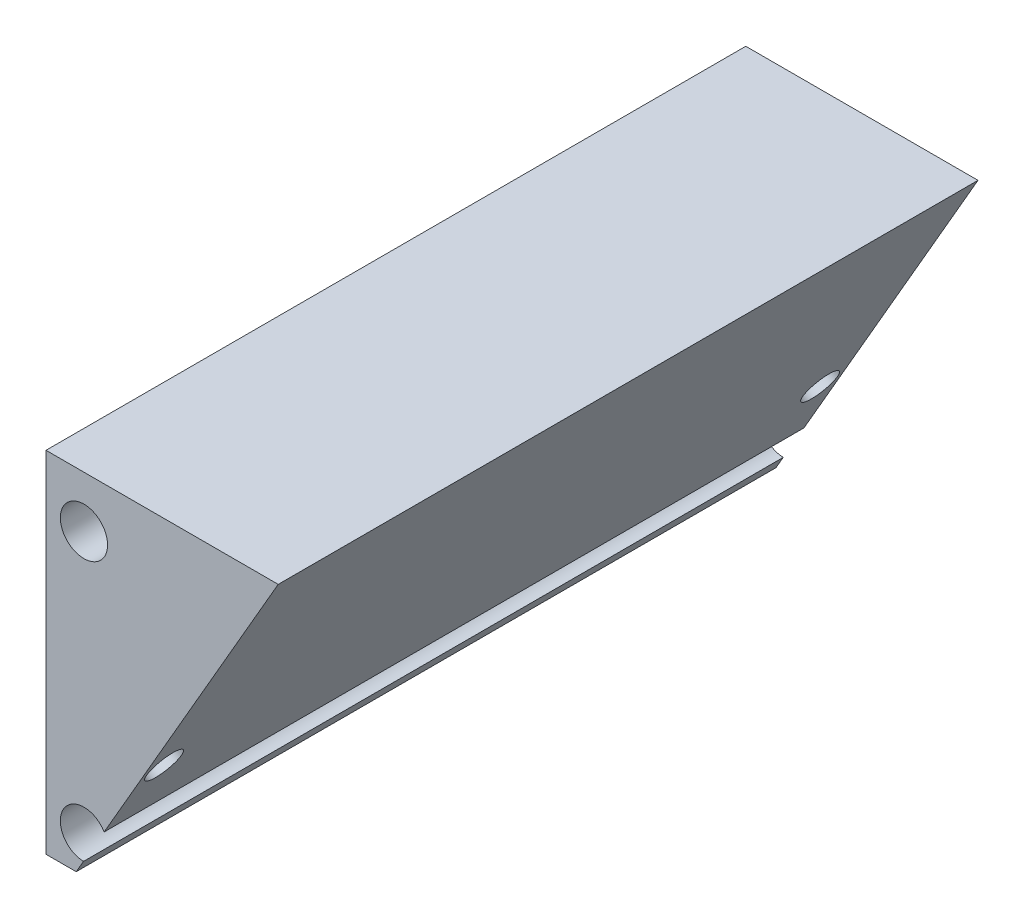
ISO-10303-21;
HEADER;
FILE_DESCRIPTION(('STEP AP214'),'2;1');
FILE_NAME('part.step','',(''),(''),'','','');
FILE_SCHEMA(('AUTOMOTIVE_DESIGN { 1 0 10303 214 1 1 1 1 }'));
ENDSEC;
DATA;
#1=APPLICATION_CONTEXT('core data for automotive mechanical design processes');
#2=APPLICATION_PROTOCOL_DEFINITION('international standard','automotive_design',2000,#1);
#3=PRODUCT_CONTEXT('',#1,'mechanical');
#4=PRODUCT('Part','Part','',(#3));
#5=PRODUCT_RELATED_PRODUCT_CATEGORY('part','',(#4));
#6=PRODUCT_DEFINITION_FORMATION('','',#4);
#7=PRODUCT_DEFINITION_CONTEXT('part definition',#1,'design');
#8=PRODUCT_DEFINITION('design','',#6,#7);
#9=PRODUCT_DEFINITION_SHAPE('','',#8);
#10=(LENGTH_UNIT() NAMED_UNIT(*) SI_UNIT(.MILLI.,.METRE.));
#11=(NAMED_UNIT(*) PLANE_ANGLE_UNIT() SI_UNIT($,.RADIAN.));
#12=(NAMED_UNIT(*) SI_UNIT($,.STERADIAN.) SOLID_ANGLE_UNIT());
#13=UNCERTAINTY_MEASURE_WITH_UNIT(LENGTH_MEASURE(1.E-05),#10,'distance_accuracy_value','');
#14=(GEOMETRIC_REPRESENTATION_CONTEXT(3) GLOBAL_UNCERTAINTY_ASSIGNED_CONTEXT((#13)) GLOBAL_UNIT_ASSIGNED_CONTEXT((#10,
#11,#12)) REPRESENTATION_CONTEXT('',''));
#15=CARTESIAN_POINT('',(0.,0.,0.));
#16=DIRECTION('',(0.,0.,1.));
#17=DIRECTION('',(1.,0.,0.));
#18=AXIS2_PLACEMENT_3D('',#15,#16,#17);
#19=CARTESIAN_POINT('',(-5.33042439962429,-7.92921842259811,40.));
#20=DIRECTION('',(0.,0.,1.));
#21=DIRECTION('',(1.,0.,0.));
#22=AXIS2_PLACEMENT_3D('',#19,#20,#21);
#23=PLANE('',#22);
#24=CARTESIAN_POINT('',(-5.33042439962429,-7.92921842259811,40.));
#25=DIRECTION('',(0.,0.,-1.));
#26=DIRECTION('',(1.,0.,0.));
#27=AXIS2_PLACEMENT_3D('',#24,#25,#26);
#28=CIRCLE('',#27,1.35);
#29=CARTESIAN_POINT('',(-5.35720586766859,-9.27895274940817,40.));
#30=VERTEX_POINT('',#29);
#31=CARTESIAN_POINT('',(-4.17491091826905,-7.23115782751607,40.));
#32=VERTEX_POINT('',#31);
#33=EDGE_CURVE('E130',#30,#32,#28,.T.);
#34=ORIENTED_EDGE('',*,*,#33,.T.);
#35=DIRECTION('',(0.499999999999998,0.86602540378444,0.));
#36=VECTOR('',#35,1.);
#37=CARTESIAN_POINT('',(0.,0.,40.));
#38=LINE('',#37,#36);
#39=CARTESIAN_POINT('',(5.77350269189622,10.,40.));
#40=VERTEX_POINT('',#39);
#41=EDGE_CURVE('E88',#32,#40,#38,.T.);
#42=ORIENTED_EDGE('',*,*,#41,.T.);
#43=DIRECTION('',(-1.,0.,0.));
#44=VECTOR('',#43,1.);
#45=CARTESIAN_POINT('',(-7.5,10.,40.));
#46=LINE('',#45,#44);
#47=CARTESIAN_POINT('',(-7.5,10.,40.));
#48=VERTEX_POINT('',#47);
#49=EDGE_CURVE('E101',#40,#48,#46,.T.);
#50=ORIENTED_EDGE('',*,*,#49,.T.);
#51=DIRECTION('',(0.,-1.,0.));
#52=VECTOR('',#51,1.);
#53=CARTESIAN_POINT('',(-7.5,10.,40.));
#54=LINE('',#53,#52);
#55=CARTESIAN_POINT('',(-7.5,-10.,40.));
#56=VERTEX_POINT('',#55);
#57=EDGE_CURVE('E95',#48,#56,#54,.T.);
#58=ORIENTED_EDGE('',*,*,#57,.T.);
#59=DIRECTION('',(1.,0.,0.));
#60=VECTOR('',#59,1.);
#61=CARTESIAN_POINT('',(-7.5,-10.,40.));
#62=LINE('',#61,#60);
#63=CARTESIAN_POINT('',(-5.77350269189622,-10.,40.));
#64=VERTEX_POINT('',#63);
#65=EDGE_CURVE('E99',#56,#64,#62,.T.);
#66=ORIENTED_EDGE('',*,*,#65,.T.);
#67=DIRECTION('',(0.499999999999999,0.866025403784439,0.));
#68=VECTOR('',#67,1.);
#69=CARTESIAN_POINT('',(-5.35720586766859,-9.27895274940817,40.));
#70=LINE('',#69,#68);
#71=EDGE_CURVE('E51',#64,#30,#70,.T.);
#72=ORIENTED_EDGE('',*,*,#71,.T.);
#73=EDGE_LOOP('',(#34,#42,#50,#58,#66,#72));
#74=FACE_BOUND('',#73,.T.);
#75=CARTESIAN_POINT('',(-5.33042439962429,7.07078157740189,40.));
#76=DIRECTION('',(0.,0.,1.));
#77=DIRECTION('',(1.,0.,0.));
#78=AXIS2_PLACEMENT_3D('',#75,#76,#77);
#79=CIRCLE('',#78,1.35);
#80=CARTESIAN_POINT('',(-3.98042439962429,7.07078157740189,40.));
#81=VERTEX_POINT('',#80);
#82=EDGE_CURVE('E123',#81,#81,#79,.T.);
#83=ORIENTED_EDGE('',*,*,#82,.F.);
#84=EDGE_LOOP('',(#83));
#85=FACE_BOUND('',#84,.T.);
#86=ADVANCED_FACE('F32',(#74,#85),#23,.T.);
#87=CARTESIAN_POINT('',(-5.33042439962429,-7.92921842259811,0.));
#88=DIRECTION('',(0.,0.,1.));
#89=DIRECTION('',(1.,0.,0.));
#90=AXIS2_PLACEMENT_3D('',#87,#88,#89);
#91=PLANE('',#90);
#92=CARTESIAN_POINT('',(-5.33042439962429,-7.92921842259811,0.));
#93=DIRECTION('',(0.,0.,-1.));
#94=DIRECTION('',(1.,0.,0.));
#95=AXIS2_PLACEMENT_3D('',#92,#93,#94);
#96=CIRCLE('',#95,1.35);
#97=CARTESIAN_POINT('',(-5.35720586766859,-9.27895274940817,0.));
#98=VERTEX_POINT('',#97);
#99=CARTESIAN_POINT('',(-4.17491091826905,-7.23115782751607,0.));
#100=VERTEX_POINT('',#99);
#101=EDGE_CURVE('E119',#98,#100,#96,.T.);
#102=ORIENTED_EDGE('',*,*,#101,.F.);
#103=DIRECTION('',(0.499999999999999,0.866025403784439,0.));
#104=VECTOR('',#103,1.);
#105=CARTESIAN_POINT('',(-5.35720586766859,-9.27895274940817,0.));
#106=LINE('',#105,#104);
#107=CARTESIAN_POINT('',(-5.77350269189622,-10.,0.));
#108=VERTEX_POINT('',#107);
#109=EDGE_CURVE('E80',#108,#98,#106,.T.);
#110=ORIENTED_EDGE('',*,*,#109,.F.);
#111=DIRECTION('',(1.,0.,0.));
#112=VECTOR('',#111,1.);
#113=CARTESIAN_POINT('',(-7.5,-10.,0.));
#114=LINE('',#113,#112);
#115=CARTESIAN_POINT('',(-7.5,-10.,0.));
#116=VERTEX_POINT('',#115);
#117=EDGE_CURVE('E74',#116,#108,#114,.T.);
#118=ORIENTED_EDGE('',*,*,#117,.F.);
#119=DIRECTION('',(0.,-1.,0.));
#120=VECTOR('',#119,1.);
#121=CARTESIAN_POINT('',(-7.5,10.,0.));
#122=LINE('',#121,#120);
#123=CARTESIAN_POINT('',(-7.5,10.,0.));
#124=VERTEX_POINT('',#123);
#125=EDGE_CURVE('E109',#124,#116,#122,.T.);
#126=ORIENTED_EDGE('',*,*,#125,.F.);
#127=DIRECTION('',(-1.,0.,0.));
#128=VECTOR('',#127,1.);
#129=CARTESIAN_POINT('',(-7.5,10.,0.));
#130=LINE('',#129,#128);
#131=CARTESIAN_POINT('',(5.77350269189622,10.,0.));
#132=VERTEX_POINT('',#131);
#133=EDGE_CURVE('E125',#132,#124,#130,.T.);
#134=ORIENTED_EDGE('',*,*,#133,.F.);
#135=DIRECTION('',(0.499999999999998,0.86602540378444,0.));
#136=VECTOR('',#135,1.);
#137=CARTESIAN_POINT('',(0.,0.,0.));
#138=LINE('',#137,#136);
#139=EDGE_CURVE('E122',#100,#132,#138,.T.);
#140=ORIENTED_EDGE('',*,*,#139,.F.);
#141=EDGE_LOOP('',(#102,#110,#118,#126,#134,#140));
#142=FACE_BOUND('',#141,.T.);
#143=CARTESIAN_POINT('',(-5.33042439962429,7.07078157740189,0.));
#144=DIRECTION('',(0.,0.,1.));
#145=DIRECTION('',(1.,0.,0.));
#146=AXIS2_PLACEMENT_3D('',#143,#144,#145);
#147=CIRCLE('',#146,1.35);
#148=CARTESIAN_POINT('',(-3.98042439962429,7.07078157740189,0.));
#149=VERTEX_POINT('',#148);
#150=EDGE_CURVE('E137',#149,#149,#147,.T.);
#151=ORIENTED_EDGE('',*,*,#150,.T.);
#152=EDGE_LOOP('',(#151));
#153=FACE_BOUND('',#152,.T.);
#154=ADVANCED_FACE('F162',(#142,#153),#91,.F.);
#155=CARTESIAN_POINT('',(-5.33042439962429,-7.92921842259811,40.));
#156=DIRECTION('',(0.,0.,-1.));
#157=DIRECTION('',(-1.,0.,0.));
#158=AXIS2_PLACEMENT_3D('',#155,#156,#157);
#159=CYLINDRICAL_SURFACE('',#158,1.35);
#160=ORIENTED_EDGE('',*,*,#101,.T.);
#161=DIRECTION('',(0.,0.,-1.));
#162=VECTOR('',#161,1.);
#163=CARTESIAN_POINT('',(-4.17491091826905,-7.23115782751607,40.));
#164=LINE('',#163,#162);
#165=EDGE_CURVE('E11',#32,#100,#164,.T.);
#166=ORIENTED_EDGE('',*,*,#165,.F.);
#167=ORIENTED_EDGE('',*,*,#33,.F.);
#168=DIRECTION('',(0.,0.,-1.));
#169=VECTOR('',#168,1.);
#170=CARTESIAN_POINT('',(-5.35720586766859,-9.27895274940817,40.));
#171=LINE('',#170,#169);
#172=EDGE_CURVE('E115',#30,#98,#171,.T.);
#173=ORIENTED_EDGE('',*,*,#172,.T.);
#174=EDGE_LOOP('',(#160,#166,#167,#173));
#175=FACE_BOUND('',#174,.T.);
#176=ADVANCED_FACE('F34',(#175),#159,.F.);
#177=CARTESIAN_POINT('',(0.,0.,40.));
#178=DIRECTION('',(-0.86602540378444,0.499999999999998,0.));
#179=DIRECTION('',(-0.499999999999998,-0.86602540378444,0.));
#180=AXIS2_PLACEMENT_3D('',#177,#178,#179);
#181=PLANE('',#180);
#182=CARTESIAN_POINT('',(-1.99999999999999,-3.46410161513776,38.75));
#183=DIRECTION('',(0.86602540378444,-0.499999999999998,0.));
#184=DIRECTION('',(0.499999999999998,0.86602540378444,0.));
#185=AXIS2_PLACEMENT_3D('',#182,#183,#184);
#186=CIRCLE('',#185,0.999999999999998);
#187=CARTESIAN_POINT('',(-1.49999999999999,-2.59807621135332,38.75));
#188=VERTEX_POINT('',#187);
#189=EDGE_CURVE('E148',#188,#188,#186,.T.);
#190=ORIENTED_EDGE('',*,*,#189,.F.);
#191=EDGE_LOOP('',(#190));
#192=FACE_BOUND('',#191,.T.);
#193=CARTESIAN_POINT('',(-1.99999999999999,-3.46410161513776,1.25));
#194=DIRECTION('',(0.86602540378444,-0.499999999999998,0.));
#195=DIRECTION('',(0.499999999999998,0.86602540378444,0.));
#196=AXIS2_PLACEMENT_3D('',#193,#194,#195);
#197=CIRCLE('',#196,1.);
#198=CARTESIAN_POINT('',(-1.49999999999999,-2.59807621135332,1.25));
#199=VERTEX_POINT('',#198);
#200=EDGE_CURVE('E138',#199,#199,#197,.T.);
#201=ORIENTED_EDGE('',*,*,#200,.F.);
#202=EDGE_LOOP('',(#201));
#203=FACE_BOUND('',#202,.T.);
#204=ORIENTED_EDGE('',*,*,#139,.T.);
#205=DIRECTION('',(0.,0.,-1.));
#206=VECTOR('',#205,1.);
#207=CARTESIAN_POINT('',(5.77350269189622,10.,40.));
#208=LINE('',#207,#206);
#209=EDGE_CURVE('E42',#40,#132,#208,.T.);
#210=ORIENTED_EDGE('',*,*,#209,.F.);
#211=ORIENTED_EDGE('',*,*,#41,.F.);
#212=ORIENTED_EDGE('',*,*,#165,.T.);
#213=EDGE_LOOP('',(#204,#210,#211,#212));
#214=FACE_BOUND('',#213,.T.);
#215=ADVANCED_FACE('F156',(#192,#203,#214),#181,.F.);
#216=CARTESIAN_POINT('',(-7.5,10.,40.));
#217=DIRECTION('',(0.,-1.,0.));
#218=DIRECTION('',(0.,0.,-1.));
#219=AXIS2_PLACEMENT_3D('',#216,#217,#218);
#220=PLANE('',#219);
#221=ORIENTED_EDGE('',*,*,#133,.T.);
#222=DIRECTION('',(0.,0.,-1.));
#223=VECTOR('',#222,1.);
#224=CARTESIAN_POINT('',(-7.5,10.,40.));
#225=LINE('',#224,#223);
#226=EDGE_CURVE('E110',#48,#124,#225,.T.);
#227=ORIENTED_EDGE('',*,*,#226,.F.);
#228=ORIENTED_EDGE('',*,*,#49,.F.);
#229=ORIENTED_EDGE('',*,*,#209,.T.);
#230=EDGE_LOOP('',(#221,#227,#228,#229));
#231=FACE_BOUND('',#230,.T.);
#232=ADVANCED_FACE('F159',(#231),#220,.F.);
#233=CARTESIAN_POINT('',(-7.5,10.,40.));
#234=DIRECTION('',(1.,0.,0.));
#235=DIRECTION('',(0.,1.,0.));
#236=AXIS2_PLACEMENT_3D('',#233,#234,#235);
#237=PLANE('',#236);
#238=CARTESIAN_POINT('',(-7.5,-0.288675134594834,38.75));
#239=DIRECTION('',(1.,0.,0.));
#240=DIRECTION('',(0.,-1.,0.));
#241=AXIS2_PLACEMENT_3D('',#238,#239,#240);
#242=ELLIPSE('',#241,1.15470053837925,0.999999999999998);
#243=CARTESIAN_POINT('',(-7.5,-1.44337567297408,38.75));
#244=VERTEX_POINT('',#243);
#245=EDGE_CURVE('E36',#244,#244,#242,.T.);
#246=ORIENTED_EDGE('',*,*,#245,.T.);
#247=EDGE_LOOP('',(#246));
#248=FACE_BOUND('',#247,.T.);
#249=CARTESIAN_POINT('',(-7.5,-0.288675134594834,1.25));
#250=DIRECTION('',(1.,0.,0.));
#251=DIRECTION('',(0.,-1.,0.));
#252=AXIS2_PLACEMENT_3D('',#249,#250,#251);
#253=ELLIPSE('',#252,1.15470053837925,1.);
#254=CARTESIAN_POINT('',(-7.5,-1.44337567297408,1.25));
#255=VERTEX_POINT('',#254);
#256=EDGE_CURVE('E135',#255,#255,#253,.T.);
#257=ORIENTED_EDGE('',*,*,#256,.T.);
#258=EDGE_LOOP('',(#257));
#259=FACE_BOUND('',#258,.T.);
#260=ORIENTED_EDGE('',*,*,#125,.T.);
#261=DIRECTION('',(0.,0.,-1.));
#262=VECTOR('',#261,1.);
#263=CARTESIAN_POINT('',(-7.5,-10.,40.));
#264=LINE('',#263,#262);
#265=EDGE_CURVE('E106',#56,#116,#264,.T.);
#266=ORIENTED_EDGE('',*,*,#265,.F.);
#267=ORIENTED_EDGE('',*,*,#57,.F.);
#268=ORIENTED_EDGE('',*,*,#226,.T.);
#269=EDGE_LOOP('',(#260,#266,#267,#268));
#270=FACE_BOUND('',#269,.T.);
#271=ADVANCED_FACE('F107',(#248,#259,#270),#237,.F.);
#272=CARTESIAN_POINT('',(-7.5,-10.,40.));
#273=DIRECTION('',(0.,1.,0.));
#274=DIRECTION('',(0.,0.,1.));
#275=AXIS2_PLACEMENT_3D('',#272,#273,#274);
#276=PLANE('',#275);
#277=ORIENTED_EDGE('',*,*,#117,.T.);
#278=DIRECTION('',(0.,0.,-1.));
#279=VECTOR('',#278,1.);
#280=CARTESIAN_POINT('',(-5.77350269189622,-10.,40.));
#281=LINE('',#280,#279);
#282=EDGE_CURVE('E111',#64,#108,#281,.T.);
#283=ORIENTED_EDGE('',*,*,#282,.F.);
#284=ORIENTED_EDGE('',*,*,#65,.F.);
#285=ORIENTED_EDGE('',*,*,#265,.T.);
#286=EDGE_LOOP('',(#277,#283,#284,#285));
#287=FACE_BOUND('',#286,.T.);
#288=ADVANCED_FACE('F113',(#287),#276,.F.);
#289=CARTESIAN_POINT('',(-5.35720586766859,-9.27895274940817,40.));
#290=DIRECTION('',(-0.866025403784439,0.499999999999999,0.));
#291=DIRECTION('',(-0.499999999999999,-0.866025403784439,0.));
#292=AXIS2_PLACEMENT_3D('',#289,#290,#291);
#293=PLANE('',#292);
#294=ORIENTED_EDGE('',*,*,#109,.T.);
#295=ORIENTED_EDGE('',*,*,#172,.F.);
#296=ORIENTED_EDGE('',*,*,#71,.F.);
#297=ORIENTED_EDGE('',*,*,#282,.T.);
#298=EDGE_LOOP('',(#294,#295,#296,#297));
#299=FACE_BOUND('',#298,.T.);
#300=ADVANCED_FACE('F165',(#299),#293,.F.);
#301=CARTESIAN_POINT('',(-5.33042439962429,7.07078157740189,40.));
#302=DIRECTION('',(0.,0.,-1.));
#303=DIRECTION('',(-1.,0.,0.));
#304=AXIS2_PLACEMENT_3D('',#301,#302,#303);
#305=CYLINDRICAL_SURFACE('',#304,1.35);
#306=ORIENTED_EDGE('',*,*,#82,.T.);
#307=EDGE_LOOP('',(#306));
#308=FACE_BOUND('',#307,.T.);
#309=ORIENTED_EDGE('',*,*,#150,.F.);
#310=EDGE_LOOP('',(#309));
#311=FACE_BOUND('',#310,.T.);
#312=ADVANCED_FACE('F167',(#308,#311),#305,.F.);
#313=CARTESIAN_POINT('',(-36.6410161513776,16.5358983848622,1.25));
#314=DIRECTION('',(0.86602540378444,-0.499999999999998,0.));
#315=DIRECTION('',(0.499999999999998,0.86602540378444,0.));
#316=AXIS2_PLACEMENT_3D('',#313,#314,#315);
#317=CYLINDRICAL_SURFACE('',#316,1.);
#318=ORIENTED_EDGE('',*,*,#200,.T.);
#319=EDGE_LOOP('',(#318));
#320=FACE_BOUND('',#319,.T.);
#321=ORIENTED_EDGE('',*,*,#256,.F.);
#322=EDGE_LOOP('',(#321));
#323=FACE_BOUND('',#322,.T.);
#324=ADVANCED_FACE('F173',(#320,#323),#317,.F.);
#325=CARTESIAN_POINT('',(-36.6410161513776,16.5358983848622,38.75));
#326=DIRECTION('',(0.86602540378444,-0.499999999999998,0.));
#327=DIRECTION('',(0.499999999999998,0.86602540378444,0.));
#328=AXIS2_PLACEMENT_3D('',#325,#326,#327);
#329=CYLINDRICAL_SURFACE('',#328,0.999999999999998);
#330=ORIENTED_EDGE('',*,*,#189,.T.);
#331=EDGE_LOOP('',(#330));
#332=FACE_BOUND('',#331,.T.);
#333=ORIENTED_EDGE('',*,*,#245,.F.);
#334=EDGE_LOOP('',(#333));
#335=FACE_BOUND('',#334,.T.);
#336=ADVANCED_FACE('F186',(#332,#335),#329,.F.);
#337=CLOSED_SHELL('',(#86,#154,#176,#215,#232,#271,#288,#300,#312,#324,#336));
#338=MANIFOLD_SOLID_BREP('B2',#337);
#339=ADVANCED_BREP_SHAPE_REPRESENTATION('',(#18,#338),#14);
#340=SHAPE_DEFINITION_REPRESENTATION(#9,#339);
ENDSEC;
END-ISO-10303-21;
